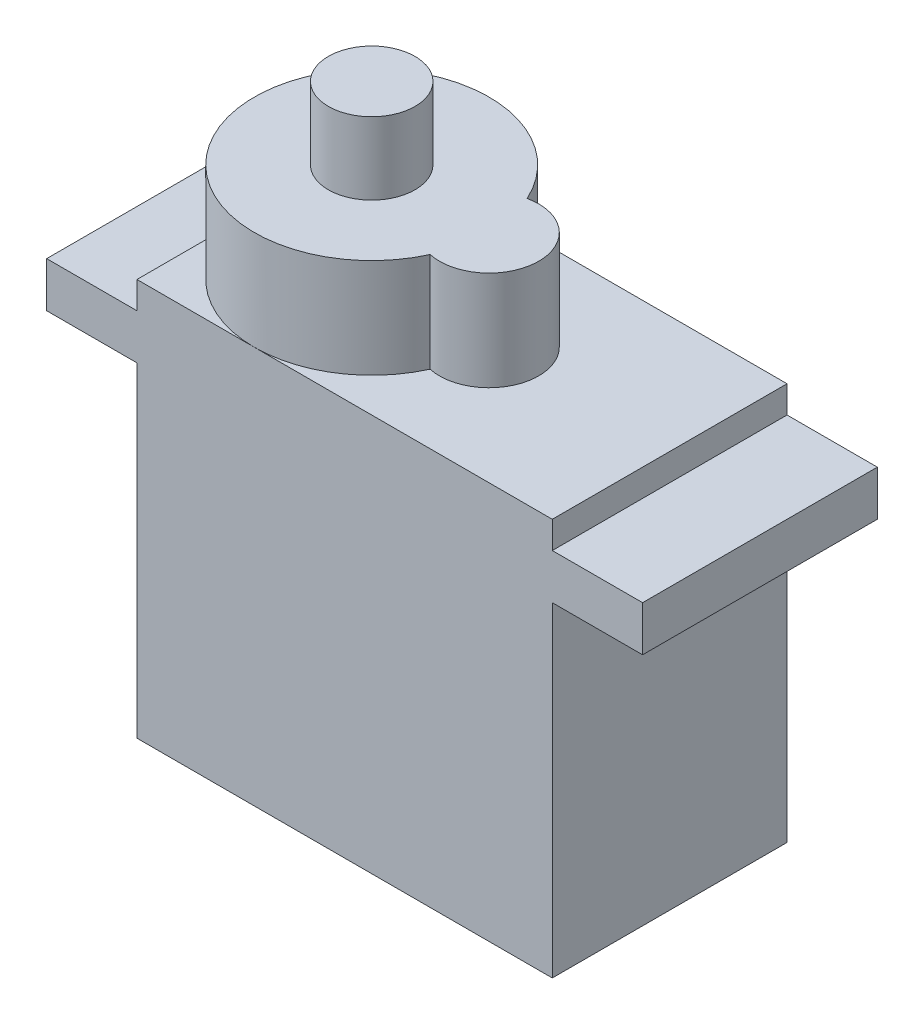
ISO-10303-21;
HEADER;
FILE_DESCRIPTION(('STEP AP214'),'2;1');
FILE_NAME('part.step','',(''),(''),'','','');
FILE_SCHEMA(('AUTOMOTIVE_DESIGN { 1 0 10303 214 1 1 1 1 }'));
ENDSEC;
DATA;
#1=APPLICATION_CONTEXT('core data for automotive mechanical design processes');
#2=APPLICATION_PROTOCOL_DEFINITION('international standard','automotive_design',2000,#1);
#3=PRODUCT_CONTEXT('',#1,'mechanical');
#4=PRODUCT('Part','Part','',(#3));
#5=PRODUCT_RELATED_PRODUCT_CATEGORY('part','',(#4));
#6=PRODUCT_DEFINITION_FORMATION('','',#4);
#7=PRODUCT_DEFINITION_CONTEXT('part definition',#1,'design');
#8=PRODUCT_DEFINITION('design','',#6,#7);
#9=PRODUCT_DEFINITION_SHAPE('','',#8);
#10=(LENGTH_UNIT() NAMED_UNIT(*) SI_UNIT(.MILLI.,.METRE.));
#11=(NAMED_UNIT(*) PLANE_ANGLE_UNIT() SI_UNIT($,.RADIAN.));
#12=(NAMED_UNIT(*) SI_UNIT($,.STERADIAN.) SOLID_ANGLE_UNIT());
#13=UNCERTAINTY_MEASURE_WITH_UNIT(LENGTH_MEASURE(1.E-05),#10,'distance_accuracy_value','');
#14=(GEOMETRIC_REPRESENTATION_CONTEXT(3) GLOBAL_UNCERTAINTY_ASSIGNED_CONTEXT((#13)) GLOBAL_UNIT_ASSIGNED_CONTEXT((#10,
#11,#12)) REPRESENTATION_CONTEXT('',''));
#15=CARTESIAN_POINT('',(0.,0.,0.));
#16=DIRECTION('',(0.,0.,1.));
#17=DIRECTION('',(1.,0.,0.));
#18=AXIS2_PLACEMENT_3D('',#15,#16,#17);
#19=CARTESIAN_POINT('',(0.,22.,0.));
#20=DIRECTION('',(0.,1.,0.));
#21=DIRECTION('',(0.,0.,1.));
#22=AXIS2_PLACEMENT_3D('',#19,#20,#21);
#23=PLANE('',#22);
#24=CARTESIAN_POINT('',(1.5,22.,0.));
#25=DIRECTION('',(0.,1.,0.));
#26=DIRECTION('',(0.,0.,1.));
#27=AXIS2_PLACEMENT_3D('',#24,#25,#26);
#28=CIRCLE('',#27,2.75);
#29=CARTESIAN_POINT('',(0.91826923076923,22.,2.68776660298661));
#30=VERTEX_POINT('',#29);
#31=CARTESIAN_POINT('',(0.91826923076923,22.,-2.68776660298661));
#32=VERTEX_POINT('',#31);
#33=EDGE_CURVE('E159',#30,#32,#28,.T.);
#34=ORIENTED_EDGE('',*,*,#33,.F.);
#35=CARTESIAN_POINT('',(-5.,22.,0.));
#36=DIRECTION('',(0.,1.,0.));
#37=DIRECTION('',(0.,0.,1.));
#38=AXIS2_PLACEMENT_3D('',#35,#36,#37);
#39=CIRCLE('',#38,6.5);
#40=CARTESIAN_POINT('',(-5.,22.,6.5));
#41=VERTEX_POINT('',#40);
#42=EDGE_CURVE('E55',#41,#30,#39,.T.);
#43=ORIENTED_EDGE('',*,*,#42,.F.);
#44=DIRECTION('',(1.,0.,0.));
#45=VECTOR('',#44,1.);
#46=CARTESIAN_POINT('',(-11.5,22.,6.5));
#47=LINE('',#46,#45);
#48=CARTESIAN_POINT('',(11.5,22.,6.5));
#49=VERTEX_POINT('',#48);
#50=EDGE_CURVE('E177',#41,#49,#47,.T.);
#51=ORIENTED_EDGE('',*,*,#50,.T.);
#52=DIRECTION('',(0.,0.,-1.));
#53=VECTOR('',#52,1.);
#54=CARTESIAN_POINT('',(11.5,22.,-6.5));
#55=LINE('',#54,#53);
#56=CARTESIAN_POINT('',(11.5,22.,-6.5));
#57=VERTEX_POINT('',#56);
#58=EDGE_CURVE('E167',#49,#57,#55,.T.);
#59=ORIENTED_EDGE('',*,*,#58,.T.);
#60=DIRECTION('',(-1.,0.,0.));
#61=VECTOR('',#60,1.);
#62=CARTESIAN_POINT('',(-11.5,22.,-6.5));
#63=LINE('',#62,#61);
#64=CARTESIAN_POINT('',(-5.,22.,-6.5));
#65=VERTEX_POINT('',#64);
#66=EDGE_CURVE('E171',#57,#65,#63,.T.);
#67=ORIENTED_EDGE('',*,*,#66,.T.);
#68=EDGE_CURVE('E43',#32,#65,#39,.T.);
#69=ORIENTED_EDGE('',*,*,#68,.F.);
#70=EDGE_LOOP('',(#34,#43,#51,#59,#67,#69));
#71=FACE_BOUND('',#70,.T.);
#72=ADVANCED_FACE('F32',(#71),#23,.T.);
#73=CARTESIAN_POINT('',(-11.5,22.,0.));
#74=VERTEX_POINT('',#73);
#75=EDGE_CURVE('E11',#65,#74,#39,.T.);
#76=ORIENTED_EDGE('',*,*,#75,.F.);
#77=CARTESIAN_POINT('',(-11.5,22.,-6.5));
#78=VERTEX_POINT('',#77);
#79=EDGE_CURVE('E170',#65,#78,#63,.T.);
#80=ORIENTED_EDGE('',*,*,#79,.T.);
#81=DIRECTION('',(0.,0.,1.));
#82=VECTOR('',#81,1.);
#83=CARTESIAN_POINT('',(-11.5,22.,-6.5));
#84=LINE('',#83,#82);
#85=EDGE_CURVE('E174',#78,#74,#84,.T.);
#86=ORIENTED_EDGE('',*,*,#85,.T.);
#87=EDGE_LOOP('',(#76,#80,#86));
#88=FACE_BOUND('',#87,.T.);
#89=ADVANCED_FACE('F281',(#88),#23,.T.);
#90=CARTESIAN_POINT('',(0.,20.5,0.));
#91=DIRECTION('',(0.,1.,0.));
#92=DIRECTION('',(0.,0.,1.));
#93=AXIS2_PLACEMENT_3D('',#90,#91,#92);
#94=PLANE('',#93);
#95=DIRECTION('',(0.,0.,-1.));
#96=VECTOR('',#95,1.);
#97=CARTESIAN_POINT('',(11.5,20.5,-6.5));
#98=LINE('',#97,#96);
#99=CARTESIAN_POINT('',(11.5,20.5,6.5));
#100=VERTEX_POINT('',#99);
#101=CARTESIAN_POINT('',(11.5,20.5,-6.5));
#102=VERTEX_POINT('',#101);
#103=EDGE_CURVE('E160',#100,#102,#98,.T.);
#104=ORIENTED_EDGE('',*,*,#103,.F.);
#105=DIRECTION('',(1.,0.,0.));
#106=VECTOR('',#105,1.);
#107=CARTESIAN_POINT('',(-16.5,20.5,6.5));
#108=LINE('',#107,#106);
#109=CARTESIAN_POINT('',(16.5,20.5,6.5));
#110=VERTEX_POINT('',#109);
#111=EDGE_CURVE('E205',#100,#110,#108,.T.);
#112=ORIENTED_EDGE('',*,*,#111,.T.);
#113=DIRECTION('',(0.,0.,-1.));
#114=VECTOR('',#113,1.);
#115=CARTESIAN_POINT('',(16.5,20.5,-6.5));
#116=LINE('',#115,#114);
#117=CARTESIAN_POINT('',(16.5,20.5,-6.5));
#118=VERTEX_POINT('',#117);
#119=EDGE_CURVE('E196',#110,#118,#116,.T.);
#120=ORIENTED_EDGE('',*,*,#119,.T.);
#121=DIRECTION('',(-1.,0.,0.));
#122=VECTOR('',#121,1.);
#123=CARTESIAN_POINT('',(-16.5,20.5,-6.5));
#124=LINE('',#123,#122);
#125=EDGE_CURVE('E201',#118,#102,#124,.T.);
#126=ORIENTED_EDGE('',*,*,#125,.T.);
#127=EDGE_LOOP('',(#104,#112,#120,#126));
#128=FACE_BOUND('',#127,.T.);
#129=ADVANCED_FACE('F287',(#128),#94,.T.);
#130=CARTESIAN_POINT('',(11.5,18.,-6.5));
#131=DIRECTION('',(-1.,0.,0.));
#132=DIRECTION('',(0.,0.,1.));
#133=AXIS2_PLACEMENT_3D('',#130,#131,#132);
#134=PLANE('',#133);
#135=DIRECTION('',(0.,0.,-1.));
#136=VECTOR('',#135,1.);
#137=CARTESIAN_POINT('',(11.5,0.,-6.5));
#138=LINE('',#137,#136);
#139=CARTESIAN_POINT('',(11.5,0.,6.5));
#140=VERTEX_POINT('',#139);
#141=CARTESIAN_POINT('',(11.5,0.,-6.5));
#142=VERTEX_POINT('',#141);
#143=EDGE_CURVE('E231',#140,#142,#138,.T.);
#144=ORIENTED_EDGE('',*,*,#143,.T.);
#145=DIRECTION('',(0.,-1.,0.));
#146=VECTOR('',#145,1.);
#147=CARTESIAN_POINT('',(11.5,18.,-6.5));
#148=LINE('',#147,#146);
#149=CARTESIAN_POINT('',(11.5,18.,-6.5));
#150=VERTEX_POINT('',#149);
#151=EDGE_CURVE('E36',#150,#142,#148,.T.);
#152=ORIENTED_EDGE('',*,*,#151,.F.);
#153=DIRECTION('',(0.,0.,-1.));
#154=VECTOR('',#153,1.);
#155=CARTESIAN_POINT('',(11.5,18.,-6.5));
#156=LINE('',#155,#154);
#157=CARTESIAN_POINT('',(11.5,18.,6.5));
#158=VERTEX_POINT('',#157);
#159=EDGE_CURVE('E232',#158,#150,#156,.T.);
#160=ORIENTED_EDGE('',*,*,#159,.F.);
#161=DIRECTION('',(0.,-1.,0.));
#162=VECTOR('',#161,1.);
#163=CARTESIAN_POINT('',(11.5,18.,6.5));
#164=LINE('',#163,#162);
#165=EDGE_CURVE('E239',#158,#140,#164,.T.);
#166=ORIENTED_EDGE('',*,*,#165,.T.);
#167=EDGE_LOOP('',(#144,#152,#160,#166));
#168=FACE_BOUND('',#167,.T.);
#169=ADVANCED_FACE('F34',(#168),#134,.F.);
#170=CARTESIAN_POINT('',(-11.5,18.,-6.5));
#171=DIRECTION('',(0.,0.,1.));
#172=DIRECTION('',(1.,0.,0.));
#173=AXIS2_PLACEMENT_3D('',#170,#171,#172);
#174=PLANE('',#173);
#175=DIRECTION('',(-1.,0.,0.));
#176=VECTOR('',#175,1.);
#177=CARTESIAN_POINT('',(-11.5,0.,-6.5));
#178=LINE('',#177,#176);
#179=CARTESIAN_POINT('',(-11.5,0.,-6.5));
#180=VERTEX_POINT('',#179);
#181=EDGE_CURVE('E242',#142,#180,#178,.T.);
#182=ORIENTED_EDGE('',*,*,#181,.T.);
#183=DIRECTION('',(0.,-1.,0.));
#184=VECTOR('',#183,1.);
#185=CARTESIAN_POINT('',(-11.5,18.,-6.5));
#186=LINE('',#185,#184);
#187=CARTESIAN_POINT('',(-11.5,18.,-6.5));
#188=VERTEX_POINT('',#187);
#189=EDGE_CURVE('E251',#188,#180,#186,.T.);
#190=ORIENTED_EDGE('',*,*,#189,.F.);
#191=DIRECTION('',(-1.,0.,0.));
#192=VECTOR('',#191,1.);
#193=CARTESIAN_POINT('',(-16.5,18.,-6.5));
#194=LINE('',#193,#192);
#195=CARTESIAN_POINT('',(-16.5,18.,-6.5));
#196=VERTEX_POINT('',#195);
#197=EDGE_CURVE('E211',#188,#196,#194,.T.);
#198=ORIENTED_EDGE('',*,*,#197,.T.);
#199=DIRECTION('',(0.,-1.,0.));
#200=VECTOR('',#199,1.);
#201=CARTESIAN_POINT('',(-16.5,20.5,-6.5));
#202=LINE('',#201,#200);
#203=CARTESIAN_POINT('',(-16.5,20.5,-6.5));
#204=VERTEX_POINT('',#203);
#205=EDGE_CURVE('E225',#204,#196,#202,.T.);
#206=ORIENTED_EDGE('',*,*,#205,.F.);
#207=CARTESIAN_POINT('',(-11.5,20.5,-6.5));
#208=VERTEX_POINT('',#207);
#209=EDGE_CURVE('E199',#208,#204,#124,.T.);
#210=ORIENTED_EDGE('',*,*,#209,.F.);
#211=DIRECTION('',(0.,-1.,0.));
#212=VECTOR('',#211,1.);
#213=CARTESIAN_POINT('',(-11.5,22.,-6.5));
#214=LINE('',#213,#212);
#215=EDGE_CURVE('E189',#78,#208,#214,.T.);
#216=ORIENTED_EDGE('',*,*,#215,.F.);
#217=ORIENTED_EDGE('',*,*,#79,.F.);
#218=ORIENTED_EDGE('',*,*,#66,.F.);
#219=DIRECTION('',(0.,-1.,0.));
#220=VECTOR('',#219,1.);
#221=CARTESIAN_POINT('',(11.5,22.,-6.5));
#222=LINE('',#221,#220);
#223=EDGE_CURVE('E192',#57,#102,#222,.T.);
#224=ORIENTED_EDGE('',*,*,#223,.T.);
#225=ORIENTED_EDGE('',*,*,#125,.F.);
#226=DIRECTION('',(0.,-1.,0.));
#227=VECTOR('',#226,1.);
#228=CARTESIAN_POINT('',(16.5,20.5,-6.5));
#229=LINE('',#228,#227);
#230=CARTESIAN_POINT('',(16.5,18.,-6.5));
#231=VERTEX_POINT('',#230);
#232=EDGE_CURVE('E228',#118,#231,#229,.T.);
#233=ORIENTED_EDGE('',*,*,#232,.T.);
#234=EDGE_CURVE('E212',#231,#150,#194,.T.);
#235=ORIENTED_EDGE('',*,*,#234,.T.);
#236=ORIENTED_EDGE('',*,*,#151,.T.);
#237=EDGE_LOOP('',(#182,#190,#198,#206,#210,#216,#217,#218,#224,#225,#233,#235,#236));
#238=FACE_BOUND('',#237,.T.);
#239=ADVANCED_FACE('F307',(#238),#174,.F.);
#240=CARTESIAN_POINT('',(-11.5,18.,-6.5));
#241=DIRECTION('',(1.,0.,0.));
#242=DIRECTION('',(0.,0.,-1.));
#243=AXIS2_PLACEMENT_3D('',#240,#241,#242);
#244=PLANE('',#243);
#245=DIRECTION('',(0.,0.,1.));
#246=VECTOR('',#245,1.);
#247=CARTESIAN_POINT('',(-11.5,0.,-6.5));
#248=LINE('',#247,#246);
#249=CARTESIAN_POINT('',(-11.5,0.,6.5));
#250=VERTEX_POINT('',#249);
#251=EDGE_CURVE('E244',#180,#250,#248,.T.);
#252=ORIENTED_EDGE('',*,*,#251,.T.);
#253=DIRECTION('',(0.,-1.,0.));
#254=VECTOR('',#253,1.);
#255=CARTESIAN_POINT('',(-11.5,18.,6.5));
#256=LINE('',#255,#254);
#257=CARTESIAN_POINT('',(-11.5,18.,6.5));
#258=VERTEX_POINT('',#257);
#259=EDGE_CURVE('E249',#258,#250,#256,.T.);
#260=ORIENTED_EDGE('',*,*,#259,.F.);
#261=DIRECTION('',(0.,0.,1.));
#262=VECTOR('',#261,1.);
#263=CARTESIAN_POINT('',(-11.5,18.,-6.5));
#264=LINE('',#263,#262);
#265=EDGE_CURVE('E235',#188,#258,#264,.T.);
#266=ORIENTED_EDGE('',*,*,#265,.F.);
#267=ORIENTED_EDGE('',*,*,#189,.T.);
#268=EDGE_LOOP('',(#252,#260,#266,#267));
#269=FACE_BOUND('',#268,.T.);
#270=ADVANCED_FACE('F335',(#269),#244,.F.);
#271=CARTESIAN_POINT('',(-11.5,18.,6.5));
#272=DIRECTION('',(0.,0.,-1.));
#273=DIRECTION('',(-1.,0.,0.));
#274=AXIS2_PLACEMENT_3D('',#271,#272,#273);
#275=PLANE('',#274);
#276=DIRECTION('',(1.,0.,0.));
#277=VECTOR('',#276,1.);
#278=CARTESIAN_POINT('',(-11.5,0.,6.5));
#279=LINE('',#278,#277);
#280=EDGE_CURVE('E236',#250,#140,#279,.T.);
#281=ORIENTED_EDGE('',*,*,#280,.T.);
#282=ORIENTED_EDGE('',*,*,#165,.F.);
#283=DIRECTION('',(1.,0.,0.));
#284=VECTOR('',#283,1.);
#285=CARTESIAN_POINT('',(-16.5,18.,6.5));
#286=LINE('',#285,#284);
#287=CARTESIAN_POINT('',(16.5,18.,6.5));
#288=VERTEX_POINT('',#287);
#289=EDGE_CURVE('E217',#158,#288,#286,.T.);
#290=ORIENTED_EDGE('',*,*,#289,.T.);
#291=DIRECTION('',(0.,-1.,0.));
#292=VECTOR('',#291,1.);
#293=CARTESIAN_POINT('',(16.5,20.5,6.5));
#294=LINE('',#293,#292);
#295=EDGE_CURVE('E208',#110,#288,#294,.T.);
#296=ORIENTED_EDGE('',*,*,#295,.F.);
#297=ORIENTED_EDGE('',*,*,#111,.F.);
#298=DIRECTION('',(0.,-1.,0.));
#299=VECTOR('',#298,1.);
#300=CARTESIAN_POINT('',(11.5,22.,6.5));
#301=LINE('',#300,#299);
#302=EDGE_CURVE('E180',#49,#100,#301,.T.);
#303=ORIENTED_EDGE('',*,*,#302,.F.);
#304=ORIENTED_EDGE('',*,*,#50,.F.);
#305=CARTESIAN_POINT('',(-11.5,22.,6.5));
#306=VERTEX_POINT('',#305);
#307=EDGE_CURVE('E178',#306,#41,#47,.T.);
#308=ORIENTED_EDGE('',*,*,#307,.F.);
#309=DIRECTION('',(0.,-1.,0.));
#310=VECTOR('',#309,1.);
#311=CARTESIAN_POINT('',(-11.5,22.,6.5));
#312=LINE('',#311,#310);
#313=CARTESIAN_POINT('',(-11.5,20.5,6.5));
#314=VERTEX_POINT('',#313);
#315=EDGE_CURVE('E186',#306,#314,#312,.T.);
#316=ORIENTED_EDGE('',*,*,#315,.T.);
#317=CARTESIAN_POINT('',(-16.5,20.5,6.5));
#318=VERTEX_POINT('',#317);
#319=EDGE_CURVE('E206',#318,#314,#108,.T.);
#320=ORIENTED_EDGE('',*,*,#319,.F.);
#321=DIRECTION('',(0.,-1.,0.));
#322=VECTOR('',#321,1.);
#323=CARTESIAN_POINT('',(-16.5,20.5,6.5));
#324=LINE('',#323,#322);
#325=CARTESIAN_POINT('',(-16.5,18.,6.5));
#326=VERTEX_POINT('',#325);
#327=EDGE_CURVE('E222',#318,#326,#324,.T.);
#328=ORIENTED_EDGE('',*,*,#327,.T.);
#329=EDGE_CURVE('E200',#326,#258,#286,.T.);
#330=ORIENTED_EDGE('',*,*,#329,.T.);
#331=ORIENTED_EDGE('',*,*,#259,.T.);
#332=EDGE_LOOP('',(#281,#282,#290,#296,#297,#303,#304,#308,#316,#320,#328,#330,#331));
#333=FACE_BOUND('',#332,.T.);
#334=ADVANCED_FACE('F312',(#333),#275,.F.);
#335=CARTESIAN_POINT('',(0.,0.,0.));
#336=DIRECTION('',(0.,1.,0.));
#337=DIRECTION('',(0.,0.,1.));
#338=AXIS2_PLACEMENT_3D('',#335,#336,#337);
#339=PLANE('',#338);
#340=ORIENTED_EDGE('',*,*,#143,.F.);
#341=ORIENTED_EDGE('',*,*,#280,.F.);
#342=ORIENTED_EDGE('',*,*,#251,.F.);
#343=ORIENTED_EDGE('',*,*,#181,.F.);
#344=EDGE_LOOP('',(#340,#341,#342,#343));
#345=FACE_BOUND('',#344,.T.);
#346=ADVANCED_FACE('F333',(#345),#339,.F.);
#347=CARTESIAN_POINT('',(0.,18.,0.));
#348=DIRECTION('',(0.,1.,0.));
#349=DIRECTION('',(0.,0.,1.));
#350=AXIS2_PLACEMENT_3D('',#347,#348,#349);
#351=PLANE('',#350);
#352=ORIENTED_EDGE('',*,*,#289,.F.);
#353=ORIENTED_EDGE('',*,*,#159,.T.);
#354=ORIENTED_EDGE('',*,*,#234,.F.);
#355=DIRECTION('',(0.,0.,-1.));
#356=VECTOR('',#355,1.);
#357=CARTESIAN_POINT('',(16.5,18.,-6.5));
#358=LINE('',#357,#356);
#359=EDGE_CURVE('E195',#288,#231,#358,.T.);
#360=ORIENTED_EDGE('',*,*,#359,.F.);
#361=EDGE_LOOP('',(#352,#353,#354,#360));
#362=FACE_BOUND('',#361,.T.);
#363=ADVANCED_FACE('F327',(#362),#351,.F.);
#364=ORIENTED_EDGE('',*,*,#197,.F.);
#365=ORIENTED_EDGE('',*,*,#265,.T.);
#366=ORIENTED_EDGE('',*,*,#329,.F.);
#367=DIRECTION('',(0.,0.,1.));
#368=VECTOR('',#367,1.);
#369=CARTESIAN_POINT('',(-16.5,18.,-6.5));
#370=LINE('',#369,#368);
#371=EDGE_CURVE('E215',#196,#326,#370,.T.);
#372=ORIENTED_EDGE('',*,*,#371,.F.);
#373=EDGE_LOOP('',(#364,#365,#366,#372));
#374=FACE_BOUND('',#373,.T.);
#375=ADVANCED_FACE('F339',(#374),#351,.F.);
#376=CARTESIAN_POINT('',(16.5,20.5,-6.5));
#377=DIRECTION('',(-1.,0.,0.));
#378=DIRECTION('',(0.,0.,1.));
#379=AXIS2_PLACEMENT_3D('',#376,#377,#378);
#380=PLANE('',#379);
#381=ORIENTED_EDGE('',*,*,#359,.T.);
#382=ORIENTED_EDGE('',*,*,#232,.F.);
#383=ORIENTED_EDGE('',*,*,#119,.F.);
#384=ORIENTED_EDGE('',*,*,#295,.T.);
#385=EDGE_LOOP('',(#381,#382,#383,#384));
#386=FACE_BOUND('',#385,.T.);
#387=ADVANCED_FACE('F323',(#386),#380,.F.);
#388=CARTESIAN_POINT('',(-16.5,20.5,-6.5));
#389=DIRECTION('',(1.,0.,0.));
#390=DIRECTION('',(0.,0.,-1.));
#391=AXIS2_PLACEMENT_3D('',#388,#389,#390);
#392=PLANE('',#391);
#393=ORIENTED_EDGE('',*,*,#371,.T.);
#394=ORIENTED_EDGE('',*,*,#327,.F.);
#395=DIRECTION('',(0.,0.,1.));
#396=VECTOR('',#395,1.);
#397=CARTESIAN_POINT('',(-16.5,20.5,-6.5));
#398=LINE('',#397,#396);
#399=EDGE_CURVE('E203',#204,#318,#398,.T.);
#400=ORIENTED_EDGE('',*,*,#399,.F.);
#401=ORIENTED_EDGE('',*,*,#205,.T.);
#402=EDGE_LOOP('',(#393,#394,#400,#401));
#403=FACE_BOUND('',#402,.T.);
#404=ADVANCED_FACE('F342',(#403),#392,.F.);
#405=DIRECTION('',(0.,0.,1.));
#406=VECTOR('',#405,1.);
#407=CARTESIAN_POINT('',(-11.5,20.5,-6.5));
#408=LINE('',#407,#406);
#409=EDGE_CURVE('E163',#208,#314,#408,.T.);
#410=ORIENTED_EDGE('',*,*,#409,.F.);
#411=ORIENTED_EDGE('',*,*,#209,.T.);
#412=ORIENTED_EDGE('',*,*,#399,.T.);
#413=ORIENTED_EDGE('',*,*,#319,.T.);
#414=EDGE_LOOP('',(#410,#411,#412,#413));
#415=FACE_BOUND('',#414,.T.);
#416=ADVANCED_FACE('F344',(#415),#94,.T.);
#417=CARTESIAN_POINT('',(11.5,22.,-6.5));
#418=DIRECTION('',(-1.,0.,0.));
#419=DIRECTION('',(0.,0.,1.));
#420=AXIS2_PLACEMENT_3D('',#417,#418,#419);
#421=PLANE('',#420);
#422=ORIENTED_EDGE('',*,*,#103,.T.);
#423=ORIENTED_EDGE('',*,*,#223,.F.);
#424=ORIENTED_EDGE('',*,*,#58,.F.);
#425=ORIENTED_EDGE('',*,*,#302,.T.);
#426=EDGE_LOOP('',(#422,#423,#424,#425));
#427=FACE_BOUND('',#426,.T.);
#428=ADVANCED_FACE('F298',(#427),#421,.F.);
#429=CARTESIAN_POINT('',(-11.5,22.,-6.5));
#430=DIRECTION('',(1.,0.,0.));
#431=DIRECTION('',(0.,0.,-1.));
#432=AXIS2_PLACEMENT_3D('',#429,#430,#431);
#433=PLANE('',#432);
#434=ORIENTED_EDGE('',*,*,#409,.T.);
#435=ORIENTED_EDGE('',*,*,#315,.F.);
#436=EDGE_CURVE('E173',#74,#306,#84,.T.);
#437=ORIENTED_EDGE('',*,*,#436,.F.);
#438=ORIENTED_EDGE('',*,*,#85,.F.);
#439=ORIENTED_EDGE('',*,*,#215,.T.);
#440=EDGE_LOOP('',(#434,#435,#437,#438,#439));
#441=FACE_BOUND('',#440,.T.);
#442=ADVANCED_FACE('F292',(#441),#433,.F.);
#443=EDGE_CURVE('E41',#74,#41,#39,.T.);
#444=ORIENTED_EDGE('',*,*,#443,.F.);
#445=ORIENTED_EDGE('',*,*,#436,.T.);
#446=ORIENTED_EDGE('',*,*,#307,.T.);
#447=EDGE_LOOP('',(#444,#445,#446));
#448=FACE_BOUND('',#447,.T.);
#449=ADVANCED_FACE('F283',(#448),#23,.T.);
#450=CARTESIAN_POINT('',(1.5,27.5,0.));
#451=DIRECTION('',(0.,-1.,0.));
#452=DIRECTION('',(0.,0.,-1.));
#453=AXIS2_PLACEMENT_3D('',#450,#451,#452);
#454=CYLINDRICAL_SURFACE('',#453,2.75);
#455=ORIENTED_EDGE('',*,*,#33,.T.);
#456=DIRECTION('',(0.,-1.,0.));
#457=VECTOR('',#456,1.);
#458=CARTESIAN_POINT('',(0.91826923076923,27.5,-2.68776660298661));
#459=LINE('',#458,#457);
#460=CARTESIAN_POINT('',(0.91826923076923,27.5,-2.68776660298661));
#461=VERTEX_POINT('',#460);
#462=EDGE_CURVE('E147',#461,#32,#459,.T.);
#463=ORIENTED_EDGE('',*,*,#462,.F.);
#464=CARTESIAN_POINT('',(1.5,27.5,0.));
#465=DIRECTION('',(0.,1.,0.));
#466=DIRECTION('',(0.,0.,1.));
#467=AXIS2_PLACEMENT_3D('',#464,#465,#466);
#468=CIRCLE('',#467,2.75);
#469=CARTESIAN_POINT('',(0.91826923076923,27.5,2.68776660298661));
#470=VERTEX_POINT('',#469);
#471=EDGE_CURVE('E153',#470,#461,#468,.T.);
#472=ORIENTED_EDGE('',*,*,#471,.F.);
#473=DIRECTION('',(0.,-1.,0.));
#474=VECTOR('',#473,1.);
#475=CARTESIAN_POINT('',(0.91826923076923,27.5,2.68776660298661));
#476=LINE('',#475,#474);
#477=EDGE_CURVE('E150',#470,#30,#476,.T.);
#478=ORIENTED_EDGE('',*,*,#477,.T.);
#479=EDGE_LOOP('',(#455,#463,#472,#478));
#480=FACE_BOUND('',#479,.T.);
#481=ADVANCED_FACE('F158',(#480),#454,.T.);
#482=CARTESIAN_POINT('',(-5.,27.5,0.));
#483=DIRECTION('',(0.,-1.,0.));
#484=DIRECTION('',(0.,0.,-1.));
#485=AXIS2_PLACEMENT_3D('',#482,#483,#484);
#486=CYLINDRICAL_SURFACE('',#485,6.5);
#487=ORIENTED_EDGE('',*,*,#68,.T.);
#488=ORIENTED_EDGE('',*,*,#75,.T.);
#489=ORIENTED_EDGE('',*,*,#443,.T.);
#490=ORIENTED_EDGE('',*,*,#42,.T.);
#491=ORIENTED_EDGE('',*,*,#477,.F.);
#492=CARTESIAN_POINT('',(-5.,27.5,0.));
#493=DIRECTION('',(0.,1.,0.));
#494=DIRECTION('',(0.,0.,1.));
#495=AXIS2_PLACEMENT_3D('',#492,#493,#494);
#496=CIRCLE('',#495,6.5);
#497=EDGE_CURVE('E143',#461,#470,#496,.T.);
#498=ORIENTED_EDGE('',*,*,#497,.F.);
#499=ORIENTED_EDGE('',*,*,#462,.T.);
#500=EDGE_LOOP('',(#487,#488,#489,#490,#491,#498,#499));
#501=FACE_BOUND('',#500,.T.);
#502=ADVANCED_FACE('F145',(#501),#486,.T.);
#503=CARTESIAN_POINT('',(-1.75,27.5,0.));
#504=DIRECTION('',(0.,1.,0.));
#505=DIRECTION('',(0.,0.,1.));
#506=AXIS2_PLACEMENT_3D('',#503,#504,#505);
#507=PLANE('',#506);
#508=CARTESIAN_POINT('',(-5.,27.5,0.));
#509=DIRECTION('',(0.,1.,0.));
#510=DIRECTION('',(0.,0.,1.));
#511=AXIS2_PLACEMENT_3D('',#508,#509,#510);
#512=CIRCLE('',#511,2.4);
#513=CARTESIAN_POINT('',(-5.,27.5,2.4));
#514=VERTEX_POINT('',#513);
#515=EDGE_CURVE('E262',#514,#514,#512,.T.);
#516=ORIENTED_EDGE('',*,*,#515,.F.);
#517=EDGE_LOOP('',(#516));
#518=FACE_BOUND('',#517,.T.);
#519=ORIENTED_EDGE('',*,*,#471,.T.);
#520=ORIENTED_EDGE('',*,*,#497,.T.);
#521=EDGE_LOOP('',(#519,#520));
#522=FACE_BOUND('',#521,.T.);
#523=ADVANCED_FACE('F155',(#518,#522),#507,.T.);
#524=CARTESIAN_POINT('',(-5.,31.5,0.));
#525=DIRECTION('',(0.,-1.,0.));
#526=DIRECTION('',(0.,0.,-1.));
#527=AXIS2_PLACEMENT_3D('',#524,#525,#526);
#528=CYLINDRICAL_SURFACE('',#527,2.4);
#529=CARTESIAN_POINT('',(-5.,31.5,0.));
#530=DIRECTION('',(0.,1.,0.));
#531=DIRECTION('',(0.,0.,1.));
#532=AXIS2_PLACEMENT_3D('',#529,#530,#531);
#533=CIRCLE('',#532,2.4);
#534=CARTESIAN_POINT('',(-5.,31.5,2.4));
#535=VERTEX_POINT('',#534);
#536=EDGE_CURVE('E260',#535,#535,#533,.T.);
#537=ORIENTED_EDGE('',*,*,#536,.F.);
#538=EDGE_LOOP('',(#537));
#539=FACE_BOUND('',#538,.T.);
#540=ORIENTED_EDGE('',*,*,#515,.T.);
#541=EDGE_LOOP('',(#540));
#542=FACE_BOUND('',#541,.T.);
#543=ADVANCED_FACE('F268',(#539,#542),#528,.T.);
#544=CARTESIAN_POINT('',(-5.,31.5,0.));
#545=DIRECTION('',(0.,1.,0.));
#546=DIRECTION('',(0.,0.,1.));
#547=AXIS2_PLACEMENT_3D('',#544,#545,#546);
#548=PLANE('',#547);
#549=ORIENTED_EDGE('',*,*,#536,.T.);
#550=EDGE_LOOP('',(#549));
#551=FACE_BOUND('',#550,.T.);
#552=ADVANCED_FACE('F276',(#551),#548,.T.);
#553=CLOSED_SHELL('',(#72,#89,#129,#169,#239,#270,#334,#346,#363,#375,#387,#404,#416,#428,#442,
#449,#481,#502,#523,#543,#552));
#554=MANIFOLD_SOLID_BREP('B2',#553);
#555=ADVANCED_BREP_SHAPE_REPRESENTATION('',(#18,#554),#14);
#556=SHAPE_DEFINITION_REPRESENTATION(#9,#555);
ENDSEC;
END-ISO-10303-21;
